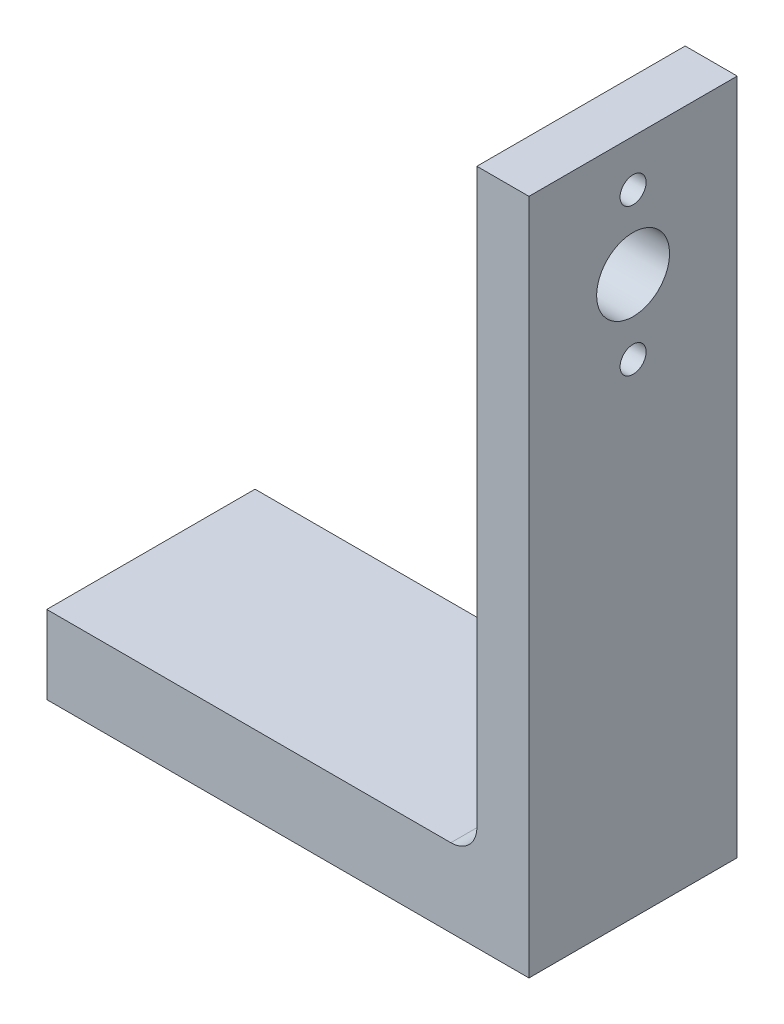
ISO-10303-21;
HEADER;
FILE_DESCRIPTION(('STEP AP214'),'2;1');
FILE_NAME('part.step','',(''),(''),'','','');
FILE_SCHEMA(('AUTOMOTIVE_DESIGN { 1 0 10303 214 1 1 1 1 }'));
ENDSEC;
DATA;
#1=APPLICATION_CONTEXT('core data for automotive mechanical design processes');
#2=APPLICATION_PROTOCOL_DEFINITION('international standard','automotive_design',2000,#1);
#3=PRODUCT_CONTEXT('',#1,'mechanical');
#4=PRODUCT('Part','Part','',(#3));
#5=PRODUCT_RELATED_PRODUCT_CATEGORY('part','',(#4));
#6=PRODUCT_DEFINITION_FORMATION('','',#4);
#7=PRODUCT_DEFINITION_CONTEXT('part definition',#1,'design');
#8=PRODUCT_DEFINITION('design','',#6,#7);
#9=PRODUCT_DEFINITION_SHAPE('','',#8);
#10=(LENGTH_UNIT() NAMED_UNIT(*) SI_UNIT(.MILLI.,.METRE.));
#11=(NAMED_UNIT(*) PLANE_ANGLE_UNIT() SI_UNIT($,.RADIAN.));
#12=(NAMED_UNIT(*) SI_UNIT($,.STERADIAN.) SOLID_ANGLE_UNIT());
#13=UNCERTAINTY_MEASURE_WITH_UNIT(LENGTH_MEASURE(1.E-05),#10,'distance_accuracy_value','');
#14=(GEOMETRIC_REPRESENTATION_CONTEXT(3) GLOBAL_UNCERTAINTY_ASSIGNED_CONTEXT((#13)) GLOBAL_UNIT_ASSIGNED_CONTEXT((#10,
#11,#12)) REPRESENTATION_CONTEXT('',''));
#15=CARTESIAN_POINT('',(0.,0.,0.));
#16=DIRECTION('',(0.,0.,1.));
#17=DIRECTION('',(1.,0.,0.));
#18=AXIS2_PLACEMENT_3D('',#15,#16,#17);
#19=CARTESIAN_POINT('',(-57.15,-17.0350961538462,25.4));
#20=DIRECTION('',(0.,1.,0.));
#21=DIRECTION('',(0.,0.,1.));
#22=AXIS2_PLACEMENT_3D('',#19,#20,#21);
#23=PLANE('',#22);
#24=DIRECTION('',(1.,0.,0.));
#25=VECTOR('',#24,1.);
#26=CARTESIAN_POINT('',(-57.15,-17.0350961538462,0.));
#27=LINE('',#26,#25);
#28=CARTESIAN_POINT('',(-57.15,-17.0350961538462,0.));
#29=VERTEX_POINT('',#28);
#30=CARTESIAN_POINT('',(1.65100000000003,-17.0350961538462,0.));
#31=VERTEX_POINT('',#30);
#32=EDGE_CURVE('E137',#29,#31,#27,.T.);
#33=ORIENTED_EDGE('',*,*,#32,.T.);
#34=DIRECTION('',(0.,0.,-1.));
#35=VECTOR('',#34,1.);
#36=CARTESIAN_POINT('',(1.65100000000003,-17.0350961538462,25.4));
#37=LINE('',#36,#35);
#38=CARTESIAN_POINT('',(1.65100000000003,-17.0350961538462,25.4));
#39=VERTEX_POINT('',#38);
#40=EDGE_CURVE('E180',#39,#31,#37,.T.);
#41=ORIENTED_EDGE('',*,*,#40,.F.);
#42=DIRECTION('',(1.,0.,0.));
#43=VECTOR('',#42,1.);
#44=CARTESIAN_POINT('',(-57.15,-17.0350961538462,25.4));
#45=LINE('',#44,#43);
#46=CARTESIAN_POINT('',(-57.15,-17.0350961538462,25.4));
#47=VERTEX_POINT('',#46);
#48=EDGE_CURVE('E140',#47,#39,#45,.T.);
#49=ORIENTED_EDGE('',*,*,#48,.F.);
#50=DIRECTION('',(0.,0.,-1.));
#51=VECTOR('',#50,1.);
#52=CARTESIAN_POINT('',(-57.15,-17.0350961538462,25.4));
#53=LINE('',#52,#51);
#54=EDGE_CURVE('E157',#47,#29,#53,.T.);
#55=ORIENTED_EDGE('',*,*,#54,.T.);
#56=EDGE_LOOP('',(#33,#41,#49,#55));
#57=FACE_BOUND('',#56,.T.);
#58=ADVANCED_FACE('F39',(#57),#23,.F.);
#59=CARTESIAN_POINT('',(1.65100000000003,-17.0350961538462,25.4));
#60=DIRECTION('',(-1.,0.,0.));
#61=DIRECTION('',(0.,0.,1.));
#62=AXIS2_PLACEMENT_3D('',#59,#60,#61);
#63=PLANE('',#62);
#64=CARTESIAN_POINT('',(1.65100000000004,41.9564038461538,12.7));
#65=DIRECTION('',(-1.,0.,0.));
#66=DIRECTION('',(0.,-1.,0.));
#67=AXIS2_PLACEMENT_3D('',#64,#65,#66);
#68=CIRCLE('',#67,1.5875);
#69=CARTESIAN_POINT('',(1.65100000000004,40.3689038461538,12.7));
#70=VERTEX_POINT('',#69);
#71=EDGE_CURVE('E122',#70,#70,#68,.T.);
#72=ORIENTED_EDGE('',*,*,#71,.T.);
#73=EDGE_LOOP('',(#72));
#74=FACE_BOUND('',#73,.T.);
#75=CARTESIAN_POINT('',(1.65100000000004,59.8634038461538,12.7));
#76=DIRECTION('',(-1.,0.,0.));
#77=DIRECTION('',(0.,-1.,0.));
#78=AXIS2_PLACEMENT_3D('',#75,#76,#77);
#79=CIRCLE('',#78,1.5875);
#80=CARTESIAN_POINT('',(1.65100000000004,58.2759038461538,12.7));
#81=VERTEX_POINT('',#80);
#82=EDGE_CURVE('E128',#81,#81,#79,.T.);
#83=ORIENTED_EDGE('',*,*,#82,.T.);
#84=EDGE_LOOP('',(#83));
#85=FACE_BOUND('',#84,.T.);
#86=CARTESIAN_POINT('',(1.65100000000004,50.9099038461538,12.7));
#87=DIRECTION('',(-1.,0.,0.));
#88=DIRECTION('',(0.,-1.,0.));
#89=AXIS2_PLACEMENT_3D('',#86,#87,#88);
#90=CIRCLE('',#89,4.445);
#91=CARTESIAN_POINT('',(1.65100000000004,46.4649038461538,12.7));
#92=VERTEX_POINT('',#91);
#93=EDGE_CURVE('E134',#92,#92,#90,.T.);
#94=ORIENTED_EDGE('',*,*,#93,.T.);
#95=EDGE_LOOP('',(#94));
#96=FACE_BOUND('',#95,.T.);
#97=DIRECTION('',(0.,1.,0.));
#98=VECTOR('',#97,1.);
#99=CARTESIAN_POINT('',(1.65100000000003,-17.0350961538462,0.));
#100=LINE('',#99,#98);
#101=CARTESIAN_POINT('',(1.65100000000003,65.5149038461538,0.));
#102=VERTEX_POINT('',#101);
#103=EDGE_CURVE('E160',#31,#102,#100,.T.);
#104=ORIENTED_EDGE('',*,*,#103,.T.);
#105=DIRECTION('',(0.,0.,-1.));
#106=VECTOR('',#105,1.);
#107=CARTESIAN_POINT('',(1.65100000000003,65.5149038461538,25.4));
#108=LINE('',#107,#106);
#109=CARTESIAN_POINT('',(1.65100000000003,65.5149038461538,25.4));
#110=VERTEX_POINT('',#109);
#111=EDGE_CURVE('E177',#110,#102,#108,.T.);
#112=ORIENTED_EDGE('',*,*,#111,.F.);
#113=DIRECTION('',(0.,1.,0.));
#114=VECTOR('',#113,1.);
#115=CARTESIAN_POINT('',(1.65100000000003,-17.0350961538462,25.4));
#116=LINE('',#115,#114);
#117=EDGE_CURVE('E143',#39,#110,#116,.T.);
#118=ORIENTED_EDGE('',*,*,#117,.F.);
#119=ORIENTED_EDGE('',*,*,#40,.T.);
#120=EDGE_LOOP('',(#104,#112,#118,#119));
#121=FACE_BOUND('',#120,.T.);
#122=ADVANCED_FACE('F208',(#74,#85,#96,#121),#63,.F.);
#123=CARTESIAN_POINT('',(1.65100000000003,65.5149038461538,25.4));
#124=DIRECTION('',(0.,-1.,0.));
#125=DIRECTION('',(0.,0.,-1.));
#126=AXIS2_PLACEMENT_3D('',#123,#124,#125);
#127=PLANE('',#126);
#128=DIRECTION('',(-1.,0.,0.));
#129=VECTOR('',#128,1.);
#130=CARTESIAN_POINT('',(1.65100000000003,65.5149038461538,0.));
#131=LINE('',#130,#129);
#132=CARTESIAN_POINT('',(-4.69899999999997,65.5149038461538,0.));
#133=VERTEX_POINT('',#132);
#134=EDGE_CURVE('E162',#102,#133,#131,.T.);
#135=ORIENTED_EDGE('',*,*,#134,.T.);
#136=DIRECTION('',(0.,0.,-1.));
#137=VECTOR('',#136,1.);
#138=CARTESIAN_POINT('',(-4.69899999999997,65.5149038461538,25.4));
#139=LINE('',#138,#137);
#140=CARTESIAN_POINT('',(-4.69899999999997,65.5149038461538,25.4));
#141=VERTEX_POINT('',#140);
#142=EDGE_CURVE('E174',#141,#133,#139,.T.);
#143=ORIENTED_EDGE('',*,*,#142,.F.);
#144=DIRECTION('',(-1.,0.,0.));
#145=VECTOR('',#144,1.);
#146=CARTESIAN_POINT('',(1.65100000000003,65.5149038461538,25.4));
#147=LINE('',#146,#145);
#148=EDGE_CURVE('E146',#110,#141,#147,.T.);
#149=ORIENTED_EDGE('',*,*,#148,.F.);
#150=ORIENTED_EDGE('',*,*,#111,.T.);
#151=EDGE_LOOP('',(#135,#143,#149,#150));
#152=FACE_BOUND('',#151,.T.);
#153=ADVANCED_FACE('F213',(#152),#127,.F.);
#154=CARTESIAN_POINT('',(-4.69899999999997,-7.51009615384615,25.4));
#155=DIRECTION('',(-1.,0.,0.));
#156=DIRECTION('',(0.,-1.,0.));
#157=AXIS2_PLACEMENT_3D('',#154,#155,#156);
#158=PLANE('',#157);
#159=CARTESIAN_POINT('',(-4.69899999999996,41.9564038461538,12.7));
#160=DIRECTION('',(-1.,0.,0.));
#161=DIRECTION('',(0.,-1.,0.));
#162=AXIS2_PLACEMENT_3D('',#159,#160,#161);
#163=CIRCLE('',#162,1.5875);
#164=CARTESIAN_POINT('',(-4.69899999999996,40.3689038461538,12.7));
#165=VERTEX_POINT('',#164);
#166=EDGE_CURVE('E121',#165,#165,#163,.T.);
#167=ORIENTED_EDGE('',*,*,#166,.F.);
#168=EDGE_LOOP('',(#167));
#169=FACE_BOUND('',#168,.T.);
#170=CARTESIAN_POINT('',(-4.69899999999996,59.8634038461538,12.7));
#171=DIRECTION('',(-1.,0.,0.));
#172=DIRECTION('',(0.,-1.,0.));
#173=AXIS2_PLACEMENT_3D('',#170,#171,#172);
#174=CIRCLE('',#173,1.5875);
#175=CARTESIAN_POINT('',(-4.69899999999996,58.2759038461538,12.7));
#176=VERTEX_POINT('',#175);
#177=EDGE_CURVE('E125',#176,#176,#174,.T.);
#178=ORIENTED_EDGE('',*,*,#177,.F.);
#179=EDGE_LOOP('',(#178));
#180=FACE_BOUND('',#179,.T.);
#181=CARTESIAN_POINT('',(-4.69899999999996,50.9099038461538,12.7));
#182=DIRECTION('',(-1.,0.,0.));
#183=DIRECTION('',(0.,-1.,0.));
#184=AXIS2_PLACEMENT_3D('',#181,#182,#183);
#185=CIRCLE('',#184,4.445);
#186=CARTESIAN_POINT('',(-4.69899999999996,46.4649038461538,12.7));
#187=VERTEX_POINT('',#186);
#188=EDGE_CURVE('E131',#187,#187,#185,.T.);
#189=ORIENTED_EDGE('',*,*,#188,.F.);
#190=EDGE_LOOP('',(#189));
#191=FACE_BOUND('',#190,.T.);
#192=DIRECTION('',(0.,1.,0.));
#193=VECTOR('',#192,1.);
#194=CARTESIAN_POINT('',(-4.69899999999997,-7.51009615384615,0.));
#195=LINE('',#194,#193);
#196=CARTESIAN_POINT('',(-4.69899999999997,-4.33509615384615,0.));
#197=VERTEX_POINT('',#196);
#198=EDGE_CURVE('E165',#197,#133,#195,.T.);
#199=ORIENTED_EDGE('',*,*,#198,.F.);
#200=DIRECTION('',(0.,0.,-1.));
#201=VECTOR('',#200,1.);
#202=CARTESIAN_POINT('',(-4.69899999999997,-4.33509615384615,25.4));
#203=LINE('',#202,#201);
#204=CARTESIAN_POINT('',(-4.69899999999997,-4.33509615384615,25.4));
#205=VERTEX_POINT('',#204);
#206=EDGE_CURVE('E54',#197,#205,#203,.F.);
#207=ORIENTED_EDGE('',*,*,#206,.T.);
#208=DIRECTION('',(0.,1.,0.));
#209=VECTOR('',#208,1.);
#210=CARTESIAN_POINT('',(-4.69899999999997,-7.51009615384615,25.4));
#211=LINE('',#210,#209);
#212=EDGE_CURVE('E149',#205,#141,#211,.T.);
#213=ORIENTED_EDGE('',*,*,#212,.T.);
#214=ORIENTED_EDGE('',*,*,#142,.T.);
#215=EDGE_LOOP('',(#199,#207,#213,#214));
#216=FACE_BOUND('',#215,.T.);
#217=ADVANCED_FACE('F219',(#169,#180,#191,#216),#158,.T.);
#218=CARTESIAN_POINT('',(-57.15,-7.51009615384615,25.4));
#219=DIRECTION('',(0.,1.,0.));
#220=DIRECTION('',(0.,0.,1.));
#221=AXIS2_PLACEMENT_3D('',#218,#219,#220);
#222=PLANE('',#221);
#223=DIRECTION('',(1.,0.,0.));
#224=VECTOR('',#223,1.);
#225=CARTESIAN_POINT('',(-57.15,-7.51009615384615,25.4));
#226=LINE('',#225,#224);
#227=CARTESIAN_POINT('',(-57.15,-7.51009615384615,25.4));
#228=VERTEX_POINT('',#227);
#229=CARTESIAN_POINT('',(-7.87399999999996,-7.51009615384615,25.4));
#230=VERTEX_POINT('',#229);
#231=EDGE_CURVE('E151',#228,#230,#226,.T.);
#232=ORIENTED_EDGE('',*,*,#231,.T.);
#233=DIRECTION('',(0.,0.,-1.));
#234=VECTOR('',#233,1.);
#235=CARTESIAN_POINT('',(-7.87399999999996,-7.51009615384615,0.));
#236=LINE('',#235,#234);
#237=CARTESIAN_POINT('',(-7.87399999999996,-7.51009615384615,0.));
#238=VERTEX_POINT('',#237);
#239=EDGE_CURVE('E183',#230,#238,#236,.T.);
#240=ORIENTED_EDGE('',*,*,#239,.T.);
#241=DIRECTION('',(1.,0.,0.));
#242=VECTOR('',#241,1.);
#243=CARTESIAN_POINT('',(-57.15,-7.51009615384615,0.));
#244=LINE('',#243,#242);
#245=CARTESIAN_POINT('',(-57.15,-7.51009615384615,0.));
#246=VERTEX_POINT('',#245);
#247=EDGE_CURVE('E167',#246,#238,#244,.T.);
#248=ORIENTED_EDGE('',*,*,#247,.F.);
#249=DIRECTION('',(0.,0.,-1.));
#250=VECTOR('',#249,1.);
#251=CARTESIAN_POINT('',(-57.15,-7.51009615384615,25.4));
#252=LINE('',#251,#250);
#253=EDGE_CURVE('E172',#228,#246,#252,.T.);
#254=ORIENTED_EDGE('',*,*,#253,.F.);
#255=EDGE_LOOP('',(#232,#240,#248,#254));
#256=FACE_BOUND('',#255,.T.);
#257=ADVANCED_FACE('F189',(#256),#222,.T.);
#258=CARTESIAN_POINT('',(-57.15,-17.0350961538462,25.4));
#259=DIRECTION('',(-1.,0.,0.));
#260=DIRECTION('',(0.,0.,1.));
#261=AXIS2_PLACEMENT_3D('',#258,#259,#260);
#262=PLANE('',#261);
#263=CARTESIAN_POINT('',(-57.15,-12.2725961538462,6.98499999999999));
#264=DIRECTION('',(-1.,0.,0.));
#265=DIRECTION('',(0.,0.,1.));
#266=AXIS2_PLACEMENT_3D('',#263,#264,#265);
#267=CIRCLE('',#266,2.0193);
#268=CARTESIAN_POINT('',(-57.15,-12.2725961538462,9.00429999999999));
#269=VERTEX_POINT('',#268);
#270=EDGE_CURVE('E111',#269,#269,#267,.T.);
#271=ORIENTED_EDGE('',*,*,#270,.F.);
#272=EDGE_LOOP('',(#271));
#273=FACE_BOUND('',#272,.T.);
#274=CARTESIAN_POINT('',(-57.15,-12.2725961538462,18.415));
#275=DIRECTION('',(-1.,0.,0.));
#276=DIRECTION('',(0.,0.,1.));
#277=AXIS2_PLACEMENT_3D('',#274,#275,#276);
#278=CIRCLE('',#277,2.0193);
#279=CARTESIAN_POINT('',(-57.15,-12.2725961538462,20.4343));
#280=VERTEX_POINT('',#279);
#281=EDGE_CURVE('E110',#280,#280,#278,.T.);
#282=ORIENTED_EDGE('',*,*,#281,.F.);
#283=EDGE_LOOP('',(#282));
#284=FACE_BOUND('',#283,.T.);
#285=DIRECTION('',(0.,1.,0.));
#286=VECTOR('',#285,1.);
#287=CARTESIAN_POINT('',(-57.15,-17.0350961538462,0.));
#288=LINE('',#287,#286);
#289=EDGE_CURVE('E144',#29,#246,#288,.T.);
#290=ORIENTED_EDGE('',*,*,#289,.F.);
#291=ORIENTED_EDGE('',*,*,#54,.F.);
#292=DIRECTION('',(0.,1.,0.));
#293=VECTOR('',#292,1.);
#294=CARTESIAN_POINT('',(-57.15,-17.0350961538462,25.4));
#295=LINE('',#294,#293);
#296=EDGE_CURVE('E154',#47,#228,#295,.T.);
#297=ORIENTED_EDGE('',*,*,#296,.T.);
#298=ORIENTED_EDGE('',*,*,#253,.T.);
#299=EDGE_LOOP('',(#290,#291,#297,#298));
#300=FACE_BOUND('',#299,.T.);
#301=ADVANCED_FACE('F197',(#273,#284,#300),#262,.T.);
#302=CARTESIAN_POINT('',(0.,0.,25.4));
#303=DIRECTION('',(0.,0.,1.));
#304=DIRECTION('',(1.,0.,0.));
#305=AXIS2_PLACEMENT_3D('',#302,#303,#304);
#306=PLANE('',#305);
#307=ORIENTED_EDGE('',*,*,#48,.T.);
#308=ORIENTED_EDGE('',*,*,#117,.T.);
#309=ORIENTED_EDGE('',*,*,#148,.T.);
#310=ORIENTED_EDGE('',*,*,#212,.F.);
#311=CARTESIAN_POINT('',(-7.87399999999996,-4.33509615384615,25.4));
#312=DIRECTION('',(0.,0.,1.));
#313=DIRECTION('',(1.,0.,0.));
#314=AXIS2_PLACEMENT_3D('',#311,#312,#313);
#315=CIRCLE('',#314,3.175);
#316=EDGE_CURVE('E11',#205,#230,#315,.F.);
#317=ORIENTED_EDGE('',*,*,#316,.T.);
#318=ORIENTED_EDGE('',*,*,#231,.F.);
#319=ORIENTED_EDGE('',*,*,#296,.F.);
#320=EDGE_LOOP('',(#307,#308,#309,#310,#317,#318,#319));
#321=FACE_BOUND('',#320,.T.);
#322=ADVANCED_FACE('F201',(#321),#306,.T.);
#323=CARTESIAN_POINT('',(0.,0.,0.));
#324=DIRECTION('',(0.,0.,1.));
#325=DIRECTION('',(1.,0.,0.));
#326=AXIS2_PLACEMENT_3D('',#323,#324,#325);
#327=PLANE('',#326);
#328=ORIENTED_EDGE('',*,*,#32,.F.);
#329=ORIENTED_EDGE('',*,*,#289,.T.);
#330=ORIENTED_EDGE('',*,*,#247,.T.);
#331=CARTESIAN_POINT('',(-7.87399999999996,-4.33509615384615,0.));
#332=DIRECTION('',(0.,0.,1.));
#333=DIRECTION('',(1.,0.,0.));
#334=AXIS2_PLACEMENT_3D('',#331,#332,#333);
#335=CIRCLE('',#334,3.175);
#336=EDGE_CURVE('E47',#238,#197,#335,.T.);
#337=ORIENTED_EDGE('',*,*,#336,.T.);
#338=ORIENTED_EDGE('',*,*,#198,.T.);
#339=ORIENTED_EDGE('',*,*,#134,.F.);
#340=ORIENTED_EDGE('',*,*,#103,.F.);
#341=EDGE_LOOP('',(#328,#329,#330,#337,#338,#339,#340));
#342=FACE_BOUND('',#341,.T.);
#343=ADVANCED_FACE('F194',(#342),#327,.F.);
#344=CARTESIAN_POINT('',(1.65100000000004,50.9099038461538,12.7));
#345=DIRECTION('',(-1.,0.,0.));
#346=DIRECTION('',(0.,-1.,0.));
#347=AXIS2_PLACEMENT_3D('',#344,#345,#346);
#348=CYLINDRICAL_SURFACE('',#347,4.445);
#349=ORIENTED_EDGE('',*,*,#93,.F.);
#350=EDGE_LOOP('',(#349));
#351=FACE_BOUND('',#350,.T.);
#352=ORIENTED_EDGE('',*,*,#188,.T.);
#353=EDGE_LOOP('',(#352));
#354=FACE_BOUND('',#353,.T.);
#355=ADVANCED_FACE('F231',(#351,#354),#348,.F.);
#356=CARTESIAN_POINT('',(1.65100000000004,59.8634038461538,12.7));
#357=DIRECTION('',(-1.,0.,0.));
#358=DIRECTION('',(0.,-1.,0.));
#359=AXIS2_PLACEMENT_3D('',#356,#357,#358);
#360=CYLINDRICAL_SURFACE('',#359,1.5875);
#361=ORIENTED_EDGE('',*,*,#82,.F.);
#362=EDGE_LOOP('',(#361));
#363=FACE_BOUND('',#362,.T.);
#364=ORIENTED_EDGE('',*,*,#177,.T.);
#365=EDGE_LOOP('',(#364));
#366=FACE_BOUND('',#365,.T.);
#367=ADVANCED_FACE('F236',(#363,#366),#360,.F.);
#368=CARTESIAN_POINT('',(1.65100000000004,41.9564038461538,12.7));
#369=DIRECTION('',(-1.,0.,0.));
#370=DIRECTION('',(0.,-1.,0.));
#371=AXIS2_PLACEMENT_3D('',#368,#369,#370);
#372=CYLINDRICAL_SURFACE('',#371,1.5875);
#373=ORIENTED_EDGE('',*,*,#71,.F.);
#374=EDGE_LOOP('',(#373));
#375=FACE_BOUND('',#374,.T.);
#376=ORIENTED_EDGE('',*,*,#166,.T.);
#377=EDGE_LOOP('',(#376));
#378=FACE_BOUND('',#377,.T.);
#379=ADVANCED_FACE('F240',(#375,#378),#372,.F.);
#380=CARTESIAN_POINT('',(-45.212,-12.2725961538462,18.415));
#381=DIRECTION('',(-1.,0.,0.));
#382=DIRECTION('',(0.,0.,1.));
#383=AXIS2_PLACEMENT_3D('',#380,#381,#382);
#384=CONICAL_SURFACE('',#383,2.0193,1.02974425867665);
#385=CARTESIAN_POINT('',(-43.9986821519976,-12.2725961538462,18.415));
#386=VERTEX_POINT('',#385);
#387=VERTEX_LOOP('',#386);
#388=FACE_BOUND('',#387,.T.);
#389=CARTESIAN_POINT('',(-45.212,-12.2725961538462,18.415));
#390=DIRECTION('',(-1.,0.,0.));
#391=DIRECTION('',(0.,0.,1.));
#392=AXIS2_PLACEMENT_3D('',#389,#390,#391);
#393=CIRCLE('',#392,2.0193);
#394=CARTESIAN_POINT('',(-45.212,-12.2725961538462,20.4343));
#395=VERTEX_POINT('',#394);
#396=EDGE_CURVE('E114',#395,#395,#393,.T.);
#397=ORIENTED_EDGE('',*,*,#396,.T.);
#398=EDGE_LOOP('',(#397));
#399=FACE_BOUND('',#398,.T.);
#400=ADVANCED_FACE('F244',(#388,#399),#384,.F.);
#401=CARTESIAN_POINT('',(-57.15,-12.2725961538462,18.415));
#402=DIRECTION('',(-1.,0.,0.));
#403=DIRECTION('',(0.,0.,1.));
#404=AXIS2_PLACEMENT_3D('',#401,#402,#403);
#405=CYLINDRICAL_SURFACE('',#404,2.0193);
#406=ORIENTED_EDGE('',*,*,#396,.F.);
#407=EDGE_LOOP('',(#406));
#408=FACE_BOUND('',#407,.T.);
#409=ORIENTED_EDGE('',*,*,#281,.T.);
#410=EDGE_LOOP('',(#409));
#411=FACE_BOUND('',#410,.T.);
#412=ADVANCED_FACE('F104',(#408,#411),#405,.F.);
#413=CARTESIAN_POINT('',(-45.212,-12.2725961538462,6.98499999999999));
#414=DIRECTION('',(-1.,0.,0.));
#415=DIRECTION('',(0.,0.,1.));
#416=AXIS2_PLACEMENT_3D('',#413,#414,#415);
#417=CONICAL_SURFACE('',#416,2.0193,1.02974425867665);
#418=CARTESIAN_POINT('',(-43.9986821519976,-12.2725961538462,6.98499999999999));
#419=VERTEX_POINT('',#418);
#420=VERTEX_LOOP('',#419);
#421=FACE_BOUND('',#420,.T.);
#422=CARTESIAN_POINT('',(-45.212,-12.2725961538462,6.98499999999999));
#423=DIRECTION('',(-1.,0.,0.));
#424=DIRECTION('',(0.,0.,1.));
#425=AXIS2_PLACEMENT_3D('',#422,#423,#424);
#426=CIRCLE('',#425,2.0193);
#427=CARTESIAN_POINT('',(-45.212,-12.2725961538462,9.00429999999999));
#428=VERTEX_POINT('',#427);
#429=EDGE_CURVE('E108',#428,#428,#426,.T.);
#430=ORIENTED_EDGE('',*,*,#429,.T.);
#431=EDGE_LOOP('',(#430));
#432=FACE_BOUND('',#431,.T.);
#433=ADVANCED_FACE('F100',(#421,#432),#417,.F.);
#434=CARTESIAN_POINT('',(-57.15,-12.2725961538462,6.98499999999999));
#435=DIRECTION('',(-1.,0.,0.));
#436=DIRECTION('',(0.,0.,1.));
#437=AXIS2_PLACEMENT_3D('',#434,#435,#436);
#438=CYLINDRICAL_SURFACE('',#437,2.0193);
#439=ORIENTED_EDGE('',*,*,#429,.F.);
#440=EDGE_LOOP('',(#439));
#441=FACE_BOUND('',#440,.T.);
#442=ORIENTED_EDGE('',*,*,#270,.T.);
#443=EDGE_LOOP('',(#442));
#444=FACE_BOUND('',#443,.T.);
#445=ADVANCED_FACE('F103',(#441,#444),#438,.F.);
#446=CARTESIAN_POINT('',(-7.87399999999996,-4.33509615384615,25.4));
#447=DIRECTION('',(0.,0.,1.));
#448=DIRECTION('',(1.,0.,0.));
#449=AXIS2_PLACEMENT_3D('',#446,#447,#448);
#450=CYLINDRICAL_SURFACE('',#449,3.175);
#451=ORIENTED_EDGE('',*,*,#316,.F.);
#452=ORIENTED_EDGE('',*,*,#206,.F.);
#453=ORIENTED_EDGE('',*,*,#336,.F.);
#454=ORIENTED_EDGE('',*,*,#239,.F.);
#455=EDGE_LOOP('',(#451,#452,#453,#454));
#456=FACE_BOUND('',#455,.T.);
#457=ADVANCED_FACE('F41',(#456),#450,.F.);
#458=CLOSED_SHELL('',(#58,#122,#153,#217,#257,#301,#322,#343,#355,#367,#379,#400,#412,#433,#445,#457));
#459=MANIFOLD_SOLID_BREP('B2',#458);
#460=ADVANCED_BREP_SHAPE_REPRESENTATION('',(#18,#459),#14);
#461=SHAPE_DEFINITION_REPRESENTATION(#9,#460);
ENDSEC;
END-ISO-10303-21;
